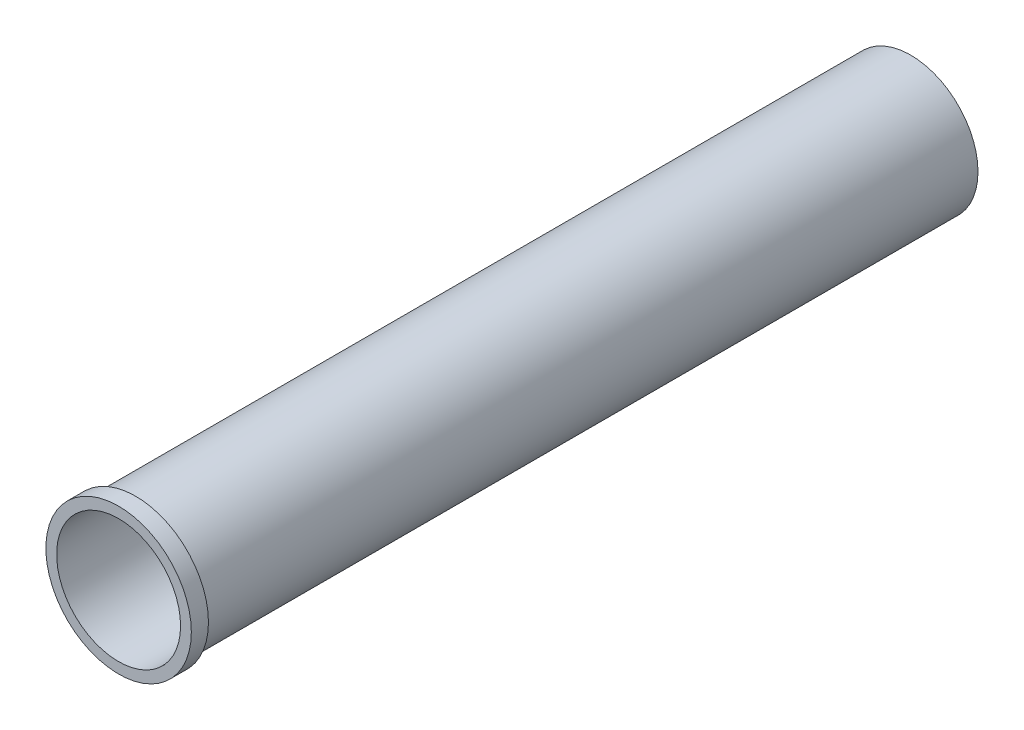
ISO-10303-21;
HEADER;
FILE_DESCRIPTION(('STEP AP214'),'2;1');
FILE_NAME('part.step','',(''),(''),'','','');
FILE_SCHEMA(('AUTOMOTIVE_DESIGN { 1 0 10303 214 1 1 1 1 }'));
ENDSEC;
DATA;
#1=APPLICATION_CONTEXT('core data for automotive mechanical design processes');
#2=APPLICATION_PROTOCOL_DEFINITION('international standard','automotive_design',2000,#1);
#3=PRODUCT_CONTEXT('',#1,'mechanical');
#4=PRODUCT('Part','Part','',(#3));
#5=PRODUCT_RELATED_PRODUCT_CATEGORY('part','',(#4));
#6=PRODUCT_DEFINITION_FORMATION('','',#4);
#7=PRODUCT_DEFINITION_CONTEXT('part definition',#1,'design');
#8=PRODUCT_DEFINITION('design','',#6,#7);
#9=PRODUCT_DEFINITION_SHAPE('','',#8);
#10=(LENGTH_UNIT() NAMED_UNIT(*) SI_UNIT(.MILLI.,.METRE.));
#11=(NAMED_UNIT(*) PLANE_ANGLE_UNIT() SI_UNIT($,.RADIAN.));
#12=(NAMED_UNIT(*) SI_UNIT($,.STERADIAN.) SOLID_ANGLE_UNIT());
#13=UNCERTAINTY_MEASURE_WITH_UNIT(LENGTH_MEASURE(1.E-05),#10,'distance_accuracy_value','');
#14=(GEOMETRIC_REPRESENTATION_CONTEXT(3) GLOBAL_UNCERTAINTY_ASSIGNED_CONTEXT((#13)) GLOBAL_UNIT_ASSIGNED_CONTEXT((#10,
#11,#12)) REPRESENTATION_CONTEXT('',''));
#15=CARTESIAN_POINT('',(0.,0.,0.));
#16=DIRECTION('',(0.,0.,1.));
#17=DIRECTION('',(1.,0.,0.));
#18=AXIS2_PLACEMENT_3D('',#15,#16,#17);
#19=CARTESIAN_POINT('',(0.,0.,147.));
#20=DIRECTION('',(0.,0.,-1.));
#21=DIRECTION('',(-1.,0.,0.));
#22=AXIS2_PLACEMENT_3D('',#19,#20,#21);
#23=CYLINDRICAL_SURFACE('',#22,25.);
#24=CARTESIAN_POINT('',(0.,0.,-147.));
#25=DIRECTION('',(0.,0.,1.));
#26=DIRECTION('',(1.,0.,0.));
#27=AXIS2_PLACEMENT_3D('',#24,#25,#26);
#28=CIRCLE('',#27,25.);
#29=CARTESIAN_POINT('',(25.,0.,-147.));
#30=VERTEX_POINT('',#29);
#31=EDGE_CURVE('E39',#30,#30,#28,.T.);
#32=ORIENTED_EDGE('',*,*,#31,.T.);
#33=EDGE_LOOP('',(#32));
#34=FACE_BOUND('',#33,.T.);
#35=CARTESIAN_POINT('',(0.,0.,140.65));
#36=DIRECTION('',(0.,0.,1.));
#37=DIRECTION('',(1.,0.,0.));
#38=AXIS2_PLACEMENT_3D('',#35,#36,#37);
#39=CIRCLE('',#38,25.);
#40=CARTESIAN_POINT('',(25.,0.,140.65));
#41=VERTEX_POINT('',#40);
#42=EDGE_CURVE('E10',#41,#41,#39,.T.);
#43=ORIENTED_EDGE('',*,*,#42,.F.);
#44=EDGE_LOOP('',(#43));
#45=FACE_BOUND('',#44,.T.);
#46=ADVANCED_FACE('F33',(#34,#45),#23,.T.);
#47=CARTESIAN_POINT('',(0.,0.,147.));
#48=DIRECTION('',(0.,0.,1.));
#49=DIRECTION('',(1.,0.,0.));
#50=AXIS2_PLACEMENT_3D('',#47,#48,#49);
#51=PLANE('',#50);
#52=CARTESIAN_POINT('',(0.,0.,147.));
#53=DIRECTION('',(0.,0.,1.));
#54=DIRECTION('',(1.,0.,0.));
#55=AXIS2_PLACEMENT_3D('',#52,#53,#54);
#56=CIRCLE('',#55,23.);
#57=CARTESIAN_POINT('',(23.,0.,147.));
#58=VERTEX_POINT('',#57);
#59=EDGE_CURVE('E43',#58,#58,#56,.T.);
#60=ORIENTED_EDGE('',*,*,#59,.F.);
#61=EDGE_LOOP('',(#60));
#62=FACE_BOUND('',#61,.T.);
#63=CARTESIAN_POINT('',(0.,0.,147.));
#64=DIRECTION('',(0.,0.,1.));
#65=DIRECTION('',(1.,0.,0.));
#66=AXIS2_PLACEMENT_3D('',#63,#64,#65);
#67=CIRCLE('',#66,27.);
#68=CARTESIAN_POINT('',(27.,0.,147.));
#69=VERTEX_POINT('',#68);
#70=EDGE_CURVE('E53',#69,#69,#67,.T.);
#71=ORIENTED_EDGE('',*,*,#70,.T.);
#72=EDGE_LOOP('',(#71));
#73=FACE_BOUND('',#72,.T.);
#74=ADVANCED_FACE('F71',(#62,#73),#51,.T.);
#75=CARTESIAN_POINT('',(0.,0.,-147.));
#76=DIRECTION('',(0.,0.,1.));
#77=DIRECTION('',(1.,0.,0.));
#78=AXIS2_PLACEMENT_3D('',#75,#76,#77);
#79=PLANE('',#78);
#80=ORIENTED_EDGE('',*,*,#31,.F.);
#81=EDGE_LOOP('',(#80));
#82=FACE_BOUND('',#81,.T.);
#83=CARTESIAN_POINT('',(0.,0.,-147.));
#84=DIRECTION('',(0.,0.,1.));
#85=DIRECTION('',(1.,0.,0.));
#86=AXIS2_PLACEMENT_3D('',#83,#84,#85);
#87=CIRCLE('',#86,23.);
#88=CARTESIAN_POINT('',(23.,0.,-147.));
#89=VERTEX_POINT('',#88);
#90=EDGE_CURVE('E47',#89,#89,#87,.T.);
#91=ORIENTED_EDGE('',*,*,#90,.T.);
#92=EDGE_LOOP('',(#91));
#93=FACE_BOUND('',#92,.T.);
#94=ADVANCED_FACE('F77',(#82,#93),#79,.F.);
#95=CARTESIAN_POINT('',(0.,0.,147.));
#96=DIRECTION('',(0.,0.,-1.));
#97=DIRECTION('',(-1.,0.,0.));
#98=AXIS2_PLACEMENT_3D('',#95,#96,#97);
#99=CYLINDRICAL_SURFACE('',#98,23.);
#100=ORIENTED_EDGE('',*,*,#59,.T.);
#101=EDGE_LOOP('',(#100));
#102=FACE_BOUND('',#101,.T.);
#103=ORIENTED_EDGE('',*,*,#90,.F.);
#104=EDGE_LOOP('',(#103));
#105=FACE_BOUND('',#104,.T.);
#106=ADVANCED_FACE('F68',(#102,#105),#99,.F.);
#107=CARTESIAN_POINT('',(0.,0.,140.65));
#108=DIRECTION('',(0.,0.,1.));
#109=DIRECTION('',(1.,0.,0.));
#110=AXIS2_PLACEMENT_3D('',#107,#108,#109);
#111=CYLINDRICAL_SURFACE('',#110,27.);
#112=CARTESIAN_POINT('',(0.,0.,140.65));
#113=DIRECTION('',(0.,0.,1.));
#114=DIRECTION('',(1.,0.,0.));
#115=AXIS2_PLACEMENT_3D('',#112,#113,#114);
#116=CIRCLE('',#115,27.);
#117=CARTESIAN_POINT('',(27.,0.,140.65));
#118=VERTEX_POINT('',#117);
#119=EDGE_CURVE('E51',#118,#118,#116,.T.);
#120=ORIENTED_EDGE('',*,*,#119,.T.);
#121=EDGE_LOOP('',(#120));
#122=FACE_BOUND('',#121,.T.);
#123=ORIENTED_EDGE('',*,*,#70,.F.);
#124=EDGE_LOOP('',(#123));
#125=FACE_BOUND('',#124,.T.);
#126=ADVANCED_FACE('F59',(#122,#125),#111,.T.);
#127=CARTESIAN_POINT('',(0.,0.,140.65));
#128=DIRECTION('',(0.,0.,1.));
#129=DIRECTION('',(1.,0.,0.));
#130=AXIS2_PLACEMENT_3D('',#127,#128,#129);
#131=PLANE('',#130);
#132=ORIENTED_EDGE('',*,*,#42,.T.);
#133=EDGE_LOOP('',(#132));
#134=FACE_BOUND('',#133,.T.);
#135=ORIENTED_EDGE('',*,*,#119,.F.);
#136=EDGE_LOOP('',(#135));
#137=FACE_BOUND('',#136,.T.);
#138=ADVANCED_FACE('F62',(#134,#137),#131,.F.);
#139=CLOSED_SHELL('',(#46,#74,#94,#106,#126,#138));
#140=MANIFOLD_SOLID_BREP('B2',#139);
#141=ADVANCED_BREP_SHAPE_REPRESENTATION('',(#18,#140),#14);
#142=SHAPE_DEFINITION_REPRESENTATION(#9,#141);
ENDSEC;
END-ISO-10303-21;
